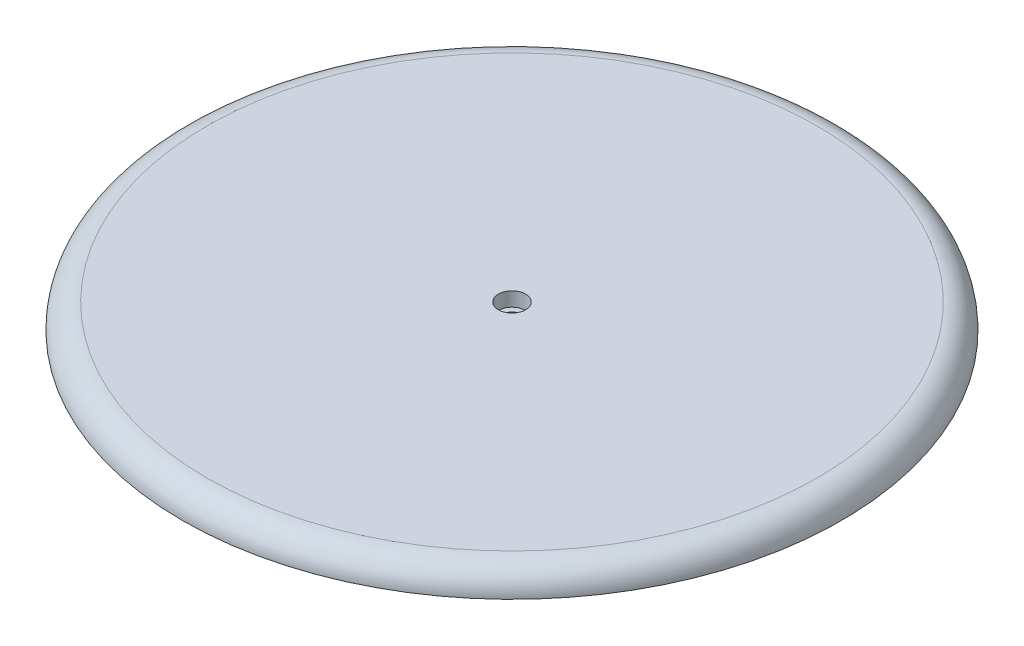
ISO-10303-21;
HEADER;
FILE_DESCRIPTION(('STEP AP214'),'2;1');
FILE_NAME('part.step','',(''),(''),'','','');
FILE_SCHEMA(('AUTOMOTIVE_DESIGN { 1 0 10303 214 1 1 1 1 }'));
ENDSEC;
DATA;
#1=APPLICATION_CONTEXT('core data for automotive mechanical design processes');
#2=APPLICATION_PROTOCOL_DEFINITION('international standard','automotive_design',2000,#1);
#3=PRODUCT_CONTEXT('',#1,'mechanical');
#4=PRODUCT('Part','Part','',(#3));
#5=PRODUCT_RELATED_PRODUCT_CATEGORY('part','',(#4));
#6=PRODUCT_DEFINITION_FORMATION('','',#4);
#7=PRODUCT_DEFINITION_CONTEXT('part definition',#1,'design');
#8=PRODUCT_DEFINITION('design','',#6,#7);
#9=PRODUCT_DEFINITION_SHAPE('','',#8);
#10=(LENGTH_UNIT() NAMED_UNIT(*) SI_UNIT(.MILLI.,.METRE.));
#11=(NAMED_UNIT(*) PLANE_ANGLE_UNIT() SI_UNIT($,.RADIAN.));
#12=(NAMED_UNIT(*) SI_UNIT($,.STERADIAN.) SOLID_ANGLE_UNIT());
#13=UNCERTAINTY_MEASURE_WITH_UNIT(LENGTH_MEASURE(1.E-05),#10,'distance_accuracy_value','');
#14=(GEOMETRIC_REPRESENTATION_CONTEXT(3) GLOBAL_UNCERTAINTY_ASSIGNED_CONTEXT((#13)) GLOBAL_UNIT_ASSIGNED_CONTEXT((#10,
#11,#12)) REPRESENTATION_CONTEXT('',''));
#15=CARTESIAN_POINT('',(0.,0.,0.));
#16=DIRECTION('',(0.,0.,1.));
#17=DIRECTION('',(1.,0.,0.));
#18=AXIS2_PLACEMENT_3D('',#15,#16,#17);
#19=CARTESIAN_POINT('',(0.,5.,0.));
#20=DIRECTION('',(0.,1.,0.));
#21=DIRECTION('',(0.,0.,1.));
#22=AXIS2_PLACEMENT_3D('',#19,#20,#21);
#23=PLANE('',#22);
#24=CARTESIAN_POINT('',(0.,5.,0.));
#25=DIRECTION('',(0.,1.,0.));
#26=DIRECTION('',(0.,0.,1.));
#27=AXIS2_PLACEMENT_3D('',#24,#25,#26);
#28=CIRCLE('',#27,62.15);
#29=CARTESIAN_POINT('',(0.,5.,62.15));
#30=VERTEX_POINT('',#29);
#31=EDGE_CURVE('E10',#30,#30,#28,.T.);
#32=ORIENTED_EDGE('',*,*,#31,.T.);
#33=EDGE_LOOP('',(#32));
#34=FACE_BOUND('',#33,.T.);
#35=CARTESIAN_POINT('',(0.,5.,0.));
#36=DIRECTION('',(0.,1.,0.));
#37=DIRECTION('',(0.,0.,1.));
#38=AXIS2_PLACEMENT_3D('',#35,#36,#37);
#39=CIRCLE('',#38,2.775);
#40=CARTESIAN_POINT('',(0.,5.,2.775));
#41=VERTEX_POINT('',#40);
#42=EDGE_CURVE('E55',#41,#41,#39,.T.);
#43=ORIENTED_EDGE('',*,*,#42,.F.);
#44=EDGE_LOOP('',(#43));
#45=FACE_BOUND('',#44,.T.);
#46=ADVANCED_FACE('F34',(#34,#45),#23,.T.);
#47=CARTESIAN_POINT('',(0.,0.,0.));
#48=DIRECTION('',(0.,1.,0.));
#49=DIRECTION('',(0.,0.,1.));
#50=AXIS2_PLACEMENT_3D('',#47,#48,#49);
#51=PLANE('',#50);
#52=CARTESIAN_POINT('',(0.,0.,0.));
#53=DIRECTION('',(0.,1.,0.));
#54=DIRECTION('',(0.,0.,1.));
#55=AXIS2_PLACEMENT_3D('',#52,#53,#54);
#56=CIRCLE('',#55,57.15);
#57=CARTESIAN_POINT('',(0.,0.,57.15));
#58=VERTEX_POINT('',#57);
#59=EDGE_CURVE('E49',#58,#58,#56,.T.);
#60=ORIENTED_EDGE('',*,*,#59,.T.);
#61=EDGE_LOOP('',(#60));
#62=FACE_BOUND('',#61,.T.);
#63=CARTESIAN_POINT('',(0.,0.,0.));
#64=DIRECTION('',(0.,1.,0.));
#65=DIRECTION('',(0.,0.,1.));
#66=AXIS2_PLACEMENT_3D('',#63,#64,#65);
#67=CIRCLE('',#66,67.15);
#68=CARTESIAN_POINT('',(0.,0.,67.15));
#69=VERTEX_POINT('',#68);
#70=EDGE_CURVE('E41',#69,#69,#67,.T.);
#71=ORIENTED_EDGE('',*,*,#70,.F.);
#72=EDGE_LOOP('',(#71));
#73=FACE_BOUND('',#72,.T.);
#74=ADVANCED_FACE('F84',(#62,#73),#51,.F.);
#75=CARTESIAN_POINT('',(0.,-2.,0.));
#76=DIRECTION('',(0.,1.,0.));
#77=DIRECTION('',(0.,0.,1.));
#78=AXIS2_PLACEMENT_3D('',#75,#76,#77);
#79=CYLINDRICAL_SURFACE('',#78,57.15);
#80=CARTESIAN_POINT('',(0.,-2.,0.));
#81=DIRECTION('',(0.,1.,0.));
#82=DIRECTION('',(0.,0.,1.));
#83=AXIS2_PLACEMENT_3D('',#80,#81,#82);
#84=CIRCLE('',#83,57.15);
#85=CARTESIAN_POINT('',(0.,-2.,57.15));
#86=VERTEX_POINT('',#85);
#87=EDGE_CURVE('E45',#86,#86,#84,.T.);
#88=ORIENTED_EDGE('',*,*,#87,.T.);
#89=EDGE_LOOP('',(#88));
#90=FACE_BOUND('',#89,.T.);
#91=ORIENTED_EDGE('',*,*,#59,.F.);
#92=EDGE_LOOP('',(#91));
#93=FACE_BOUND('',#92,.T.);
#94=ADVANCED_FACE('F89',(#90,#93),#79,.T.);
#95=CARTESIAN_POINT('',(0.,-2.,0.));
#96=DIRECTION('',(0.,1.,0.));
#97=DIRECTION('',(0.,0.,1.));
#98=AXIS2_PLACEMENT_3D('',#95,#96,#97);
#99=PLANE('',#98);
#100=CARTESIAN_POINT('',(0.,-2.,0.));
#101=DIRECTION('',(0.,1.,0.));
#102=DIRECTION('',(0.,0.,1.));
#103=AXIS2_PLACEMENT_3D('',#100,#101,#102);
#104=CIRCLE('',#103,1.6);
#105=CARTESIAN_POINT('',(0.,-2.,1.6));
#106=VERTEX_POINT('',#105);
#107=EDGE_CURVE('E58',#106,#106,#104,.F.);
#108=ORIENTED_EDGE('',*,*,#107,.F.);
#109=EDGE_LOOP('',(#108));
#110=FACE_BOUND('',#109,.T.);
#111=ORIENTED_EDGE('',*,*,#87,.F.);
#112=EDGE_LOOP('',(#111));
#113=FACE_BOUND('',#112,.T.);
#114=ADVANCED_FACE('F79',(#110,#113),#99,.F.);
#115=CARTESIAN_POINT('',(0.,2.11,0.));
#116=DIRECTION('',(0.,1.,0.));
#117=DIRECTION('',(0.,0.,1.));
#118=AXIS2_PLACEMENT_3D('',#115,#116,#117);
#119=CYLINDRICAL_SURFACE('',#118,2.775);
#120=CARTESIAN_POINT('',(0.,2.11,0.));
#121=DIRECTION('',(0.,1.,0.));
#122=DIRECTION('',(0.,0.,1.));
#123=AXIS2_PLACEMENT_3D('',#120,#121,#122);
#124=CIRCLE('',#123,2.775);
#125=CARTESIAN_POINT('',(0.,2.11,2.775));
#126=VERTEX_POINT('',#125);
#127=EDGE_CURVE('E53',#126,#126,#124,.T.);
#128=CARTESIAN_POINT('',(0.,2.11,2.775));
#129=CARTESIAN_POINT('',(0.,2.14010416666667,2.775));
#130=CARTESIAN_POINT('',(0.,2.17020833333333,2.775));
#131=CARTESIAN_POINT('',(0.,2.23041666666667,2.775));
#132=CARTESIAN_POINT('',(0.,2.26052083333333,2.775));
#133=CARTESIAN_POINT('',(0.,2.32072916666667,2.775));
#134=CARTESIAN_POINT('',(0.,2.35083333333333,2.775));
#135=CARTESIAN_POINT('',(0.,2.41104166666667,2.775));
#136=CARTESIAN_POINT('',(0.,2.44114583333333,2.775));
#137=CARTESIAN_POINT('',(0.,2.50135416666667,2.775));
#138=CARTESIAN_POINT('',(0.,2.53145833333333,2.775));
#139=CARTESIAN_POINT('',(0.,2.59166666666667,2.775));
#140=CARTESIAN_POINT('',(0.,2.62177083333333,2.775));
#141=CARTESIAN_POINT('',(0.,2.68197916666667,2.775));
#142=CARTESIAN_POINT('',(0.,2.71208333333333,2.775));
#143=CARTESIAN_POINT('',(0.,2.77229166666667,2.775));
#144=CARTESIAN_POINT('',(0.,2.80239583333333,2.775));
#145=CARTESIAN_POINT('',(0.,2.86260416666667,2.775));
#146=CARTESIAN_POINT('',(0.,2.89270833333333,2.775));
#147=CARTESIAN_POINT('',(0.,2.95291666666667,2.775));
#148=CARTESIAN_POINT('',(0.,2.98302083333333,2.775));
#149=CARTESIAN_POINT('',(0.,3.04322916666667,2.775));
#150=CARTESIAN_POINT('',(0.,3.07333333333333,2.775));
#151=CARTESIAN_POINT('',(0.,3.13354166666667,2.775));
#152=CARTESIAN_POINT('',(0.,3.16364583333333,2.775));
#153=CARTESIAN_POINT('',(0.,3.22385416666667,2.775));
#154=CARTESIAN_POINT('',(0.,3.25395833333333,2.775));
#155=CARTESIAN_POINT('',(0.,3.31416666666667,2.775));
#156=CARTESIAN_POINT('',(0.,3.34427083333333,2.775));
#157=CARTESIAN_POINT('',(0.,3.40447916666667,2.775));
#158=CARTESIAN_POINT('',(0.,3.43458333333333,2.775));
#159=CARTESIAN_POINT('',(0.,3.49479166666667,2.775));
#160=CARTESIAN_POINT('',(0.,3.52489583333333,2.775));
#161=CARTESIAN_POINT('',(0.,3.58510416666667,2.775));
#162=CARTESIAN_POINT('',(0.,3.61520833333333,2.775));
#163=CARTESIAN_POINT('',(0.,3.67541666666667,2.775));
#164=CARTESIAN_POINT('',(0.,3.70552083333333,2.775));
#165=CARTESIAN_POINT('',(0.,3.76572916666667,2.775));
#166=CARTESIAN_POINT('',(0.,3.79583333333333,2.775));
#167=CARTESIAN_POINT('',(0.,3.85604166666667,2.775));
#168=CARTESIAN_POINT('',(0.,3.88614583333333,2.775));
#169=CARTESIAN_POINT('',(0.,3.94635416666667,2.775));
#170=CARTESIAN_POINT('',(0.,3.97645833333333,2.775));
#171=CARTESIAN_POINT('',(0.,4.03666666666667,2.775));
#172=CARTESIAN_POINT('',(0.,4.06677083333333,2.775));
#173=CARTESIAN_POINT('',(0.,4.12697916666667,2.775));
#174=CARTESIAN_POINT('',(0.,4.15708333333333,2.775));
#175=CARTESIAN_POINT('',(0.,4.21729166666667,2.775));
#176=CARTESIAN_POINT('',(0.,4.24739583333333,2.775));
#177=CARTESIAN_POINT('',(0.,4.30760416666667,2.775));
#178=CARTESIAN_POINT('',(0.,4.33770833333333,2.775));
#179=CARTESIAN_POINT('',(0.,4.39791666666667,2.775));
#180=CARTESIAN_POINT('',(0.,4.42802083333333,2.775));
#181=CARTESIAN_POINT('',(0.,4.48822916666667,2.775));
#182=CARTESIAN_POINT('',(0.,4.51833333333333,2.775));
#183=CARTESIAN_POINT('',(0.,4.57854166666667,2.775));
#184=CARTESIAN_POINT('',(0.,4.60864583333333,2.775));
#185=CARTESIAN_POINT('',(0.,4.66885416666667,2.775));
#186=CARTESIAN_POINT('',(0.,4.69895833333333,2.775));
#187=CARTESIAN_POINT('',(0.,4.75916666666667,2.775));
#188=CARTESIAN_POINT('',(0.,4.78927083333333,2.775));
#189=CARTESIAN_POINT('',(0.,4.84947916666667,2.775));
#190=CARTESIAN_POINT('',(0.,4.87958333333333,2.775));
#191=CARTESIAN_POINT('',(0.,4.93979166666667,2.775));
#192=CARTESIAN_POINT('',(0.,4.96989583333333,2.775));
#193=CARTESIAN_POINT('',(0.,5.,2.775));
#194=B_SPLINE_CURVE_WITH_KNOTS('',3,(#128,#129,#130,#131,#132,#133,#134,#135,#136,#137,#138,
#139,#140,#141,#142,#143,#144,#145,#146,#147,#148,#149,#150,#151,#152,#153,#154,#155,#156,#157,
#158,#159,#160,#161,#162,#163,#164,#165,#166,#167,#168,#169,#170,#171,#172,#173,#174,#175,#176,
#177,#178,#179,#180,#181,#182,#183,#184,#185,#186,#187,#188,#189,#190,#191,#192,#193),
.UNSPECIFIED.,.F.,.F.,(4,2,2,2,2,2,2,2,2,2,2,2,2,2,2,2,2,2,2,2,2,2,2,2,2,2,2,2,2,2,2,2,4),(0.,
0.0903124999999997,0.180625,0.2709375,0.36125,0.4515625,0.541875,0.6321875,0.7225,0.8128125,
0.903125,0.9934375,1.08375,1.1740625,1.264375,1.3546875,1.445,1.5353125,1.625625,1.7159375,
1.80625,1.8965625,1.986875,2.0771875,2.1675,2.2578125,2.348125,2.4384375,2.52875,2.6190625,
2.709375,2.7996875,2.89),.UNSPECIFIED.);
#195=EDGE_CURVE('BSEAM73',#126,#41,#194,.T.);
#196=ORIENTED_EDGE('',*,*,#127,.F.);
#197=ORIENTED_EDGE('',*,*,#42,.T.);
#198=ORIENTED_EDGE('',*,*,#195,.T.);
#199=ORIENTED_EDGE('',*,*,#195,.F.);
#200=EDGE_LOOP('',(#196,#198,#197,#199));
#201=FACE_BOUND('',#200,.T.);
#202=ADVANCED_FACE('F73',(#201),#119,.F.);
#203=CARTESIAN_POINT('',(0.,2.11,0.));
#204=DIRECTION('',(0.,1.,0.));
#205=DIRECTION('',(0.,0.,1.));
#206=AXIS2_PLACEMENT_3D('',#203,#204,#205);
#207=PLANE('',#206);
#208=CARTESIAN_POINT('',(0.,2.11,0.));
#209=DIRECTION('',(0.,1.,0.));
#210=DIRECTION('',(0.,0.,1.));
#211=AXIS2_PLACEMENT_3D('',#208,#209,#210);
#212=CIRCLE('',#211,1.6);
#213=CARTESIAN_POINT('',(0.,2.11,1.6));
#214=VERTEX_POINT('',#213);
#215=EDGE_CURVE('E63',#214,#214,#212,.T.);
#216=ORIENTED_EDGE('',*,*,#215,.F.);
#217=EDGE_LOOP('',(#216));
#218=FACE_BOUND('',#217,.T.);
#219=ORIENTED_EDGE('',*,*,#127,.T.);
#220=EDGE_LOOP('',(#219));
#221=FACE_BOUND('',#220,.T.);
#222=ADVANCED_FACE('F70',(#218,#221),#207,.T.);
#223=CARTESIAN_POINT('',(0.,-2.001,0.));
#224=DIRECTION('',(0.,1.,0.));
#225=DIRECTION('',(0.,0.,1.));
#226=AXIS2_PLACEMENT_3D('',#223,#224,#225);
#227=CYLINDRICAL_SURFACE('',#226,1.6);
#228=ORIENTED_EDGE('',*,*,#215,.T.);
#229=EDGE_LOOP('',(#228));
#230=FACE_BOUND('',#229,.T.);
#231=ORIENTED_EDGE('',*,*,#107,.T.);
#232=EDGE_LOOP('',(#231));
#233=FACE_BOUND('',#232,.T.);
#234=ADVANCED_FACE('F67',(#230,#233),#227,.F.);
#235=CARTESIAN_POINT('',(0.,0.,0.));
#236=DIRECTION('',(0.,1.,0.));
#237=DIRECTION('',(0.,0.,1.));
#238=AXIS2_PLACEMENT_3D('',#235,#236,#237);
#239=TOROIDAL_SURFACE('',#238,62.15,5.);
#240=ORIENTED_EDGE('',*,*,#70,.T.);
#241=EDGE_LOOP('',(#240));
#242=FACE_BOUND('',#241,.T.);
#243=ORIENTED_EDGE('',*,*,#31,.F.);
#244=EDGE_LOOP('',(#243));
#245=FACE_BOUND('',#244,.T.);
#246=ADVANCED_FACE('F36',(#242,#245),#239,.T.);
#247=CLOSED_SHELL('',(#46,#74,#94,#114,#202,#222,#234,#246));
#248=MANIFOLD_SOLID_BREP('B2',#247);
#249=ADVANCED_BREP_SHAPE_REPRESENTATION('',(#18,#248),#14);
#250=SHAPE_DEFINITION_REPRESENTATION(#9,#249);
ENDSEC;
END-ISO-10303-21;
